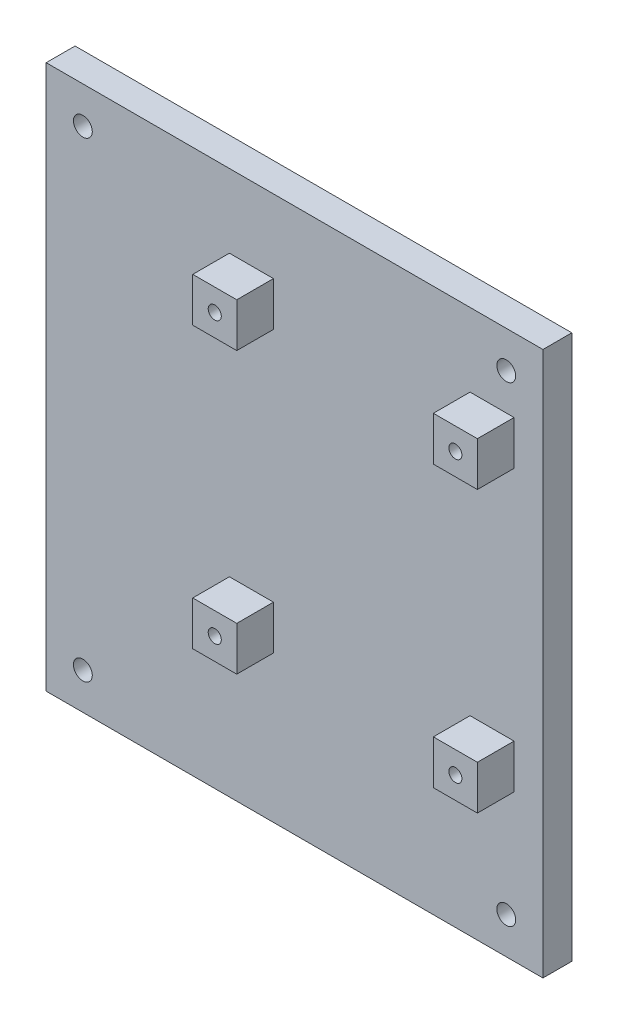
ISO-10303-21;
HEADER;
FILE_DESCRIPTION(('STEP AP214'),'2;1');
FILE_NAME('part.step','',(''),(''),'','','');
FILE_SCHEMA(('AUTOMOTIVE_DESIGN { 1 0 10303 214 1 1 1 1 }'));
ENDSEC;
DATA;
#1=APPLICATION_CONTEXT('core data for automotive mechanical design processes');
#2=APPLICATION_PROTOCOL_DEFINITION('international standard','automotive_design',2000,#1);
#3=PRODUCT_CONTEXT('',#1,'mechanical');
#4=PRODUCT('Part','Part','',(#3));
#5=PRODUCT_RELATED_PRODUCT_CATEGORY('part','',(#4));
#6=PRODUCT_DEFINITION_FORMATION('','',#4);
#7=PRODUCT_DEFINITION_CONTEXT('part definition',#1,'design');
#8=PRODUCT_DEFINITION('design','',#6,#7);
#9=PRODUCT_DEFINITION_SHAPE('','',#8);
#10=(LENGTH_UNIT() NAMED_UNIT(*) SI_UNIT(.MILLI.,.METRE.));
#11=(NAMED_UNIT(*) PLANE_ANGLE_UNIT() SI_UNIT($,.RADIAN.));
#12=(NAMED_UNIT(*) SI_UNIT($,.STERADIAN.) SOLID_ANGLE_UNIT());
#13=UNCERTAINTY_MEASURE_WITH_UNIT(LENGTH_MEASURE(1.E-05),#10,'distance_accuracy_value','');
#14=(GEOMETRIC_REPRESENTATION_CONTEXT(3) GLOBAL_UNCERTAINTY_ASSIGNED_CONTEXT((#13)) GLOBAL_UNIT_ASSIGNED_CONTEXT((#10,
#11,#12)) REPRESENTATION_CONTEXT('',''));
#15=CARTESIAN_POINT('',(0.,0.,0.));
#16=DIRECTION('',(0.,0.,1.));
#17=DIRECTION('',(1.,0.,0.));
#18=AXIS2_PLACEMENT_3D('',#15,#16,#17);
#19=CARTESIAN_POINT('',(0.,0.,4.999999906));
#20=DIRECTION('',(0.,0.,-1.));
#21=DIRECTION('',(-1.,0.,0.));
#22=AXIS2_PLACEMENT_3D('',#19,#20,#21);
#23=PLANE('',#22);
#24=CARTESIAN_POINT('',(-36.649999852,40.767,4.999999906));
#25=DIRECTION('',(0.,0.,1.));
#26=DIRECTION('',(1.,0.,0.));
#27=AXIS2_PLACEMENT_3D('',#24,#25,#26);
#28=CIRCLE('',#27,1.63195);
#29=CARTESIAN_POINT('',(-35.018049852,40.767,4.999999906));
#30=VERTEX_POINT('',#29);
#31=EDGE_CURVE('E797',#30,#30,#28,.T.);
#32=ORIENTED_EDGE('',*,*,#31,.F.);
#33=EDGE_LOOP('',(#32));
#34=FACE_BOUND('',#33,.T.);
#35=CARTESIAN_POINT('',(36.649999852,40.767,4.999999906));
#36=DIRECTION('',(0.,0.,1.));
#37=DIRECTION('',(1.,0.,0.));
#38=AXIS2_PLACEMENT_3D('',#35,#36,#37);
#39=CIRCLE('',#38,1.63195);
#40=CARTESIAN_POINT('',(38.281949852,40.767,4.999999906));
#41=VERTEX_POINT('',#40);
#42=EDGE_CURVE('E799',#41,#41,#39,.T.);
#43=ORIENTED_EDGE('',*,*,#42,.F.);
#44=EDGE_LOOP('',(#43));
#45=FACE_BOUND('',#44,.T.);
#46=CARTESIAN_POINT('',(-36.649999852,-40.767,4.999999906));
#47=DIRECTION('',(0.,0.,1.));
#48=DIRECTION('',(1.,0.,0.));
#49=AXIS2_PLACEMENT_3D('',#46,#47,#48);
#50=CIRCLE('',#49,1.63195);
#51=CARTESIAN_POINT('',(-35.018049852,-40.767,4.999999906));
#52=VERTEX_POINT('',#51);
#53=EDGE_CURVE('E807',#52,#52,#50,.T.);
#54=ORIENTED_EDGE('',*,*,#53,.F.);
#55=EDGE_LOOP('',(#54));
#56=FACE_BOUND('',#55,.T.);
#57=CARTESIAN_POINT('',(36.649999852,-40.767,4.999999906));
#58=DIRECTION('',(0.,0.,1.));
#59=DIRECTION('',(1.,0.,0.));
#60=AXIS2_PLACEMENT_3D('',#57,#58,#59);
#61=CIRCLE('',#60,1.63195);
#62=CARTESIAN_POINT('',(38.281949852,-40.767,4.999999906));
#63=VERTEX_POINT('',#62);
#64=EDGE_CURVE('E813',#63,#63,#61,.T.);
#65=ORIENTED_EDGE('',*,*,#64,.F.);
#66=EDGE_LOOP('',(#65));
#67=FACE_BOUND('',#66,.T.);
#68=DIRECTION('',(0.,-1.,0.));
#69=VECTOR('',#68,1.);
#70=CARTESIAN_POINT('',(-11.276000054,-14.097,4.999999906));
#71=LINE('',#70,#69);
#72=CARTESIAN_POINT('',(-11.276000054,-14.097,4.999999906));
#73=VERTEX_POINT('',#72);
#74=CARTESIAN_POINT('',(-11.276000054,-21.717,4.999999906));
#75=VERTEX_POINT('',#74);
#76=EDGE_CURVE('E245',#73,#75,#71,.T.);
#77=ORIENTED_EDGE('',*,*,#76,.F.);
#78=DIRECTION('',(-1.,0.,0.));
#79=VECTOR('',#78,1.);
#80=CARTESIAN_POINT('',(-11.276000054,-14.097,4.999999906));
#81=LINE('',#80,#79);
#82=CARTESIAN_POINT('',(-3.65600005399999,-14.097,4.999999906));
#83=VERTEX_POINT('',#82);
#84=EDGE_CURVE('E250',#83,#73,#81,.T.);
#85=ORIENTED_EDGE('',*,*,#84,.F.);
#86=DIRECTION('',(0.,1.,0.));
#87=VECTOR('',#86,1.);
#88=CARTESIAN_POINT('',(-3.65600005399999,-14.097,4.999999906));
#89=LINE('',#88,#87);
#90=CARTESIAN_POINT('',(-3.65600005399999,-21.717,4.999999906));
#91=VERTEX_POINT('',#90);
#92=EDGE_CURVE('E262',#91,#83,#89,.T.);
#93=ORIENTED_EDGE('',*,*,#92,.F.);
#94=DIRECTION('',(1.,0.,0.));
#95=VECTOR('',#94,1.);
#96=CARTESIAN_POINT('',(-11.276000054,-21.717,4.999999906));
#97=LINE('',#96,#95);
#98=EDGE_CURVE('E259',#75,#91,#97,.T.);
#99=ORIENTED_EDGE('',*,*,#98,.F.);
#100=EDGE_LOOP('',(#77,#85,#93,#99));
#101=FACE_BOUND('',#100,.T.);
#102=DIRECTION('',(0.,-1.,0.));
#103=VECTOR('',#102,1.);
#104=CARTESIAN_POINT('',(-11.276000054,34.417,4.999999906));
#105=LINE('',#104,#103);
#106=CARTESIAN_POINT('',(-11.276000054,34.417,4.999999906));
#107=VERTEX_POINT('',#106);
#108=CARTESIAN_POINT('',(-11.276000054,26.797,4.999999906));
#109=VERTEX_POINT('',#108);
#110=EDGE_CURVE('E311',#107,#109,#105,.T.);
#111=ORIENTED_EDGE('',*,*,#110,.F.);
#112=DIRECTION('',(-1.,0.,0.));
#113=VECTOR('',#112,1.);
#114=CARTESIAN_POINT('',(-11.276000054,34.417,4.999999906));
#115=LINE('',#114,#113);
#116=CARTESIAN_POINT('',(-3.65600005399999,34.417,4.999999906));
#117=VERTEX_POINT('',#116);
#118=EDGE_CURVE('E316',#117,#107,#115,.T.);
#119=ORIENTED_EDGE('',*,*,#118,.F.);
#120=DIRECTION('',(0.,1.,0.));
#121=VECTOR('',#120,1.);
#122=CARTESIAN_POINT('',(-3.65600005399999,34.417,4.999999906));
#123=LINE('',#122,#121);
#124=CARTESIAN_POINT('',(-3.65600005399999,26.797,4.999999906));
#125=VERTEX_POINT('',#124);
#126=EDGE_CURVE('E328',#125,#117,#123,.T.);
#127=ORIENTED_EDGE('',*,*,#126,.F.);
#128=DIRECTION('',(1.,0.,0.));
#129=VECTOR('',#128,1.);
#130=CARTESIAN_POINT('',(-11.276000054,26.797,4.999999906));
#131=LINE('',#130,#129);
#132=EDGE_CURVE('E325',#109,#125,#131,.T.);
#133=ORIENTED_EDGE('',*,*,#132,.F.);
#134=EDGE_LOOP('',(#111,#119,#127,#133));
#135=FACE_BOUND('',#134,.T.);
#136=DIRECTION('',(0.,1.,0.));
#137=VECTOR('',#136,1.);
#138=CARTESIAN_POINT('',(42.999999852,-47.117,4.999999906));
#139=LINE('',#138,#137);
#140=CARTESIAN_POINT('',(42.999999852,-47.117,4.999999906));
#141=VERTEX_POINT('',#140);
#142=CARTESIAN_POINT('',(42.999999852,47.117,4.999999906));
#143=VERTEX_POINT('',#142);
#144=EDGE_CURVE('E345',#141,#143,#139,.T.);
#145=ORIENTED_EDGE('',*,*,#144,.T.);
#146=DIRECTION('',(-1.,0.,0.));
#147=VECTOR('',#146,1.);
#148=CARTESIAN_POINT('',(-42.999999852,47.117,4.999999906));
#149=LINE('',#148,#147);
#150=CARTESIAN_POINT('',(-42.999999852,47.117,4.999999906));
#151=VERTEX_POINT('',#150);
#152=EDGE_CURVE('E348',#143,#151,#149,.T.);
#153=ORIENTED_EDGE('',*,*,#152,.T.);
#154=DIRECTION('',(0.,-1.,0.));
#155=VECTOR('',#154,1.);
#156=CARTESIAN_POINT('',(-42.999999852,-47.117,4.999999906));
#157=LINE('',#156,#155);
#158=CARTESIAN_POINT('',(-42.999999852,-47.117,4.999999906));
#159=VERTEX_POINT('',#158);
#160=EDGE_CURVE('E351',#151,#159,#157,.T.);
#161=ORIENTED_EDGE('',*,*,#160,.T.);
#162=DIRECTION('',(1.,0.,0.));
#163=VECTOR('',#162,1.);
#164=CARTESIAN_POINT('',(-42.999999852,-47.117,4.999999906));
#165=LINE('',#164,#163);
#166=EDGE_CURVE('E353',#159,#141,#165,.T.);
#167=ORIENTED_EDGE('',*,*,#166,.T.);
#168=EDGE_LOOP('',(#145,#153,#161,#167));
#169=FACE_BOUND('',#168,.T.);
#170=DIRECTION('',(0.,-1.,0.));
#171=VECTOR('',#170,1.);
#172=CARTESIAN_POINT('',(30.379999946,34.417,4.999999906));
#173=LINE('',#172,#171);
#174=CARTESIAN_POINT('',(30.379999946,34.417,4.999999906));
#175=VERTEX_POINT('',#174);
#176=CARTESIAN_POINT('',(30.379999946,26.797,4.999999906));
#177=VERTEX_POINT('',#176);
#178=EDGE_CURVE('E278',#175,#177,#173,.T.);
#179=ORIENTED_EDGE('',*,*,#178,.F.);
#180=DIRECTION('',(-1.,0.,0.));
#181=VECTOR('',#180,1.);
#182=CARTESIAN_POINT('',(30.379999946,34.417,4.999999906));
#183=LINE('',#182,#181);
#184=CARTESIAN_POINT('',(37.999999946,34.417,4.999999906));
#185=VERTEX_POINT('',#184);
#186=EDGE_CURVE('E283',#185,#175,#183,.T.);
#187=ORIENTED_EDGE('',*,*,#186,.F.);
#188=DIRECTION('',(0.,1.,0.));
#189=VECTOR('',#188,1.);
#190=CARTESIAN_POINT('',(37.999999946,34.417,4.999999906));
#191=LINE('',#190,#189);
#192=CARTESIAN_POINT('',(37.999999946,26.797,4.999999906));
#193=VERTEX_POINT('',#192);
#194=EDGE_CURVE('E295',#193,#185,#191,.T.);
#195=ORIENTED_EDGE('',*,*,#194,.F.);
#196=DIRECTION('',(1.,0.,0.));
#197=VECTOR('',#196,1.);
#198=CARTESIAN_POINT('',(30.379999946,26.797,4.999999906));
#199=LINE('',#198,#197);
#200=EDGE_CURVE('E292',#177,#193,#199,.T.);
#201=ORIENTED_EDGE('',*,*,#200,.F.);
#202=EDGE_LOOP('',(#179,#187,#195,#201));
#203=FACE_BOUND('',#202,.T.);
#204=DIRECTION('',(0.,-1.,0.));
#205=VECTOR('',#204,1.);
#206=CARTESIAN_POINT('',(30.379999946,-14.097,4.999999906));
#207=LINE('',#206,#205);
#208=CARTESIAN_POINT('',(30.379999946,-14.097,4.999999906));
#209=VERTEX_POINT('',#208);
#210=CARTESIAN_POINT('',(30.379999946,-21.717,4.999999906));
#211=VERTEX_POINT('',#210);
#212=EDGE_CURVE('E217',#209,#211,#207,.T.);
#213=ORIENTED_EDGE('',*,*,#212,.F.);
#214=DIRECTION('',(-1.,0.,0.));
#215=VECTOR('',#214,1.);
#216=CARTESIAN_POINT('',(30.379999946,-14.097,4.999999906));
#217=LINE('',#216,#215);
#218=CARTESIAN_POINT('',(37.999999946,-14.097,4.999999906));
#219=VERTEX_POINT('',#218);
#220=EDGE_CURVE('E222',#219,#209,#217,.T.);
#221=ORIENTED_EDGE('',*,*,#220,.F.);
#222=DIRECTION('',(0.,1.,0.));
#223=VECTOR('',#222,1.);
#224=CARTESIAN_POINT('',(37.999999946,-14.097,4.999999906));
#225=LINE('',#224,#223);
#226=CARTESIAN_POINT('',(37.999999946,-21.717,4.999999906));
#227=VERTEX_POINT('',#226);
#228=EDGE_CURVE('E57',#227,#219,#225,.T.);
#229=ORIENTED_EDGE('',*,*,#228,.F.);
#230=DIRECTION('',(1.,0.,0.));
#231=VECTOR('',#230,1.);
#232=CARTESIAN_POINT('',(30.379999946,-21.717,4.999999906));
#233=LINE('',#232,#231);
#234=EDGE_CURVE('E52',#211,#227,#233,.T.);
#235=ORIENTED_EDGE('',*,*,#234,.F.);
#236=EDGE_LOOP('',(#213,#221,#229,#235));
#237=FACE_BOUND('',#236,.T.);
#238=ADVANCED_FACE('F37',(#34,#45,#56,#67,#101,#135,#169,#203,#237),#23,.F.);
#239=CARTESIAN_POINT('',(42.999999852,-47.117,4.999999906));
#240=DIRECTION('',(-1.,0.,0.));
#241=DIRECTION('',(0.,0.,1.));
#242=AXIS2_PLACEMENT_3D('',#239,#240,#241);
#243=PLANE('',#242);
#244=DIRECTION('',(0.,1.,0.));
#245=VECTOR('',#244,1.);
#246=CARTESIAN_POINT('',(42.999999852,-47.117,0.));
#247=LINE('',#246,#245);
#248=CARTESIAN_POINT('',(42.999999852,-47.117,0.));
#249=VERTEX_POINT('',#248);
#250=CARTESIAN_POINT('',(42.999999852,47.117,0.));
#251=VERTEX_POINT('',#250);
#252=EDGE_CURVE('E344',#249,#251,#247,.T.);
#253=ORIENTED_EDGE('',*,*,#252,.T.);
#254=DIRECTION('',(0.,0.,-1.));
#255=VECTOR('',#254,1.);
#256=CARTESIAN_POINT('',(42.999999852,47.117,4.999999906));
#257=LINE('',#256,#255);
#258=EDGE_CURVE('E11',#143,#251,#257,.T.);
#259=ORIENTED_EDGE('',*,*,#258,.F.);
#260=ORIENTED_EDGE('',*,*,#144,.F.);
#261=DIRECTION('',(0.,0.,-1.));
#262=VECTOR('',#261,1.);
#263=CARTESIAN_POINT('',(42.999999852,-47.117,4.999999906));
#264=LINE('',#263,#262);
#265=EDGE_CURVE('E355',#141,#249,#264,.T.);
#266=ORIENTED_EDGE('',*,*,#265,.T.);
#267=EDGE_LOOP('',(#253,#259,#260,#266));
#268=FACE_BOUND('',#267,.T.);
#269=ADVANCED_FACE('F39',(#268),#243,.F.);
#270=CARTESIAN_POINT('',(-42.999999852,47.117,4.999999906));
#271=DIRECTION('',(0.,-1.,0.));
#272=DIRECTION('',(0.,0.,-1.));
#273=AXIS2_PLACEMENT_3D('',#270,#271,#272);
#274=PLANE('',#273);
#275=DIRECTION('',(-1.,0.,0.));
#276=VECTOR('',#275,1.);
#277=CARTESIAN_POINT('',(-42.999999852,47.117,0.));
#278=LINE('',#277,#276);
#279=CARTESIAN_POINT('',(-42.999999852,47.117,0.));
#280=VERTEX_POINT('',#279);
#281=EDGE_CURVE('E358',#251,#280,#278,.T.);
#282=ORIENTED_EDGE('',*,*,#281,.T.);
#283=DIRECTION('',(0.,0.,-1.));
#284=VECTOR('',#283,1.);
#285=CARTESIAN_POINT('',(-42.999999852,47.117,4.999999906));
#286=LINE('',#285,#284);
#287=EDGE_CURVE('E45',#151,#280,#286,.T.);
#288=ORIENTED_EDGE('',*,*,#287,.F.);
#289=ORIENTED_EDGE('',*,*,#152,.F.);
#290=ORIENTED_EDGE('',*,*,#258,.T.);
#291=EDGE_LOOP('',(#282,#288,#289,#290));
#292=FACE_BOUND('',#291,.T.);
#293=ADVANCED_FACE('F388',(#292),#274,.F.);
#294=CARTESIAN_POINT('',(-42.999999852,-47.117,4.999999906));
#295=DIRECTION('',(1.,0.,0.));
#296=DIRECTION('',(0.,0.,-1.));
#297=AXIS2_PLACEMENT_3D('',#294,#295,#296);
#298=PLANE('',#297);
#299=DIRECTION('',(0.,-1.,0.));
#300=VECTOR('',#299,1.);
#301=CARTESIAN_POINT('',(-42.999999852,-47.117,0.));
#302=LINE('',#301,#300);
#303=CARTESIAN_POINT('',(-42.999999852,-47.117,0.));
#304=VERTEX_POINT('',#303);
#305=EDGE_CURVE('E360',#280,#304,#302,.T.);
#306=ORIENTED_EDGE('',*,*,#305,.T.);
#307=DIRECTION('',(0.,0.,-1.));
#308=VECTOR('',#307,1.);
#309=CARTESIAN_POINT('',(-42.999999852,-47.117,4.999999906));
#310=LINE('',#309,#308);
#311=EDGE_CURVE('E365',#159,#304,#310,.T.);
#312=ORIENTED_EDGE('',*,*,#311,.F.);
#313=ORIENTED_EDGE('',*,*,#160,.F.);
#314=ORIENTED_EDGE('',*,*,#287,.T.);
#315=EDGE_LOOP('',(#306,#312,#313,#314));
#316=FACE_BOUND('',#315,.T.);
#317=ADVANCED_FACE('F372',(#316),#298,.F.);
#318=CARTESIAN_POINT('',(-42.999999852,-47.117,4.999999906));
#319=DIRECTION('',(0.,1.,0.));
#320=DIRECTION('',(0.,0.,1.));
#321=AXIS2_PLACEMENT_3D('',#318,#319,#320);
#322=PLANE('',#321);
#323=DIRECTION('',(1.,0.,0.));
#324=VECTOR('',#323,1.);
#325=CARTESIAN_POINT('',(-42.999999852,-47.117,0.));
#326=LINE('',#325,#324);
#327=EDGE_CURVE('E349',#304,#249,#326,.T.);
#328=ORIENTED_EDGE('',*,*,#327,.T.);
#329=ORIENTED_EDGE('',*,*,#265,.F.);
#330=ORIENTED_EDGE('',*,*,#166,.F.);
#331=ORIENTED_EDGE('',*,*,#311,.T.);
#332=EDGE_LOOP('',(#328,#329,#330,#331));
#333=FACE_BOUND('',#332,.T.);
#334=ADVANCED_FACE('F381',(#333),#322,.F.);
#335=CARTESIAN_POINT('',(0.,0.,0.));
#336=DIRECTION('',(0.,0.,-1.));
#337=DIRECTION('',(-1.,0.,0.));
#338=AXIS2_PLACEMENT_3D('',#335,#336,#337);
#339=PLANE('',#338);
#340=CARTESIAN_POINT('',(-36.649999852,40.767,0.));
#341=DIRECTION('',(0.,0.,1.));
#342=DIRECTION('',(1.,0.,0.));
#343=AXIS2_PLACEMENT_3D('',#340,#341,#342);
#344=CIRCLE('',#343,1.63195);
#345=CARTESIAN_POINT('',(-35.018049852,40.767,0.));
#346=VERTEX_POINT('',#345);
#347=EDGE_CURVE('E795',#346,#346,#344,.T.);
#348=ORIENTED_EDGE('',*,*,#347,.T.);
#349=EDGE_LOOP('',(#348));
#350=FACE_BOUND('',#349,.T.);
#351=CARTESIAN_POINT('',(36.649999852,40.767,0.));
#352=DIRECTION('',(0.,0.,1.));
#353=DIRECTION('',(1.,0.,0.));
#354=AXIS2_PLACEMENT_3D('',#351,#352,#353);
#355=CIRCLE('',#354,1.63195);
#356=CARTESIAN_POINT('',(38.281949852,40.767,0.));
#357=VERTEX_POINT('',#356);
#358=EDGE_CURVE('E804',#357,#357,#355,.T.);
#359=ORIENTED_EDGE('',*,*,#358,.T.);
#360=EDGE_LOOP('',(#359));
#361=FACE_BOUND('',#360,.T.);
#362=CARTESIAN_POINT('',(-36.649999852,-40.767,0.));
#363=DIRECTION('',(0.,0.,1.));
#364=DIRECTION('',(1.,0.,0.));
#365=AXIS2_PLACEMENT_3D('',#362,#363,#364);
#366=CIRCLE('',#365,1.63195);
#367=CARTESIAN_POINT('',(-35.018049852,-40.767,0.));
#368=VERTEX_POINT('',#367);
#369=EDGE_CURVE('E810',#368,#368,#366,.T.);
#370=ORIENTED_EDGE('',*,*,#369,.T.);
#371=EDGE_LOOP('',(#370));
#372=FACE_BOUND('',#371,.T.);
#373=CARTESIAN_POINT('',(36.649999852,-40.767,0.));
#374=DIRECTION('',(0.,0.,1.));
#375=DIRECTION('',(1.,0.,0.));
#376=AXIS2_PLACEMENT_3D('',#373,#374,#375);
#377=CIRCLE('',#376,1.63195);
#378=CARTESIAN_POINT('',(38.281949852,-40.767,0.));
#379=VERTEX_POINT('',#378);
#380=EDGE_CURVE('E199',#379,#379,#377,.T.);
#381=ORIENTED_EDGE('',*,*,#380,.T.);
#382=EDGE_LOOP('',(#381));
#383=FACE_BOUND('',#382,.T.);
#384=ORIENTED_EDGE('',*,*,#252,.F.);
#385=ORIENTED_EDGE('',*,*,#327,.F.);
#386=ORIENTED_EDGE('',*,*,#305,.F.);
#387=ORIENTED_EDGE('',*,*,#281,.F.);
#388=EDGE_LOOP('',(#384,#385,#386,#387));
#389=FACE_BOUND('',#388,.T.);
#390=ADVANCED_FACE('F378',(#350,#361,#372,#383,#389),#339,.T.);
#391=CARTESIAN_POINT('',(-11.276000054,34.417,11.349999906));
#392=DIRECTION('',(1.,0.,0.));
#393=DIRECTION('',(0.,0.,-1.));
#394=AXIS2_PLACEMENT_3D('',#391,#392,#393);
#395=PLANE('',#394);
#396=ORIENTED_EDGE('',*,*,#110,.T.);
#397=DIRECTION('',(0.,0.,-1.));
#398=VECTOR('',#397,1.);
#399=CARTESIAN_POINT('',(-11.276000054,26.797,11.349999906));
#400=LINE('',#399,#398);
#401=CARTESIAN_POINT('',(-11.276000054,26.797,11.349999906));
#402=VERTEX_POINT('',#401);
#403=EDGE_CURVE('E341',#402,#109,#400,.T.);
#404=ORIENTED_EDGE('',*,*,#403,.F.);
#405=DIRECTION('',(0.,-1.,0.));
#406=VECTOR('',#405,1.);
#407=CARTESIAN_POINT('',(-11.276000054,34.417,11.349999906));
#408=LINE('',#407,#406);
#409=CARTESIAN_POINT('',(-11.276000054,34.417,11.349999906));
#410=VERTEX_POINT('',#409);
#411=EDGE_CURVE('E312',#410,#402,#408,.T.);
#412=ORIENTED_EDGE('',*,*,#411,.F.);
#413=DIRECTION('',(0.,0.,-1.));
#414=VECTOR('',#413,1.);
#415=CARTESIAN_POINT('',(-11.276000054,34.417,11.349999906));
#416=LINE('',#415,#414);
#417=EDGE_CURVE('E322',#410,#107,#416,.T.);
#418=ORIENTED_EDGE('',*,*,#417,.T.);
#419=EDGE_LOOP('',(#396,#404,#412,#418));
#420=FACE_BOUND('',#419,.T.);
#421=ADVANCED_FACE('F404',(#420),#395,.F.);
#422=CARTESIAN_POINT('',(-11.276000054,26.797,11.349999906));
#423=DIRECTION('',(0.,1.,0.));
#424=DIRECTION('',(0.,0.,1.));
#425=AXIS2_PLACEMENT_3D('',#422,#423,#424);
#426=PLANE('',#425);
#427=ORIENTED_EDGE('',*,*,#132,.T.);
#428=DIRECTION('',(0.,0.,-1.));
#429=VECTOR('',#428,1.);
#430=CARTESIAN_POINT('',(-3.65600005399999,26.797,11.349999906));
#431=LINE('',#430,#429);
#432=CARTESIAN_POINT('',(-3.65600005399999,26.797,11.349999906));
#433=VERTEX_POINT('',#432);
#434=EDGE_CURVE('E338',#433,#125,#431,.T.);
#435=ORIENTED_EDGE('',*,*,#434,.F.);
#436=DIRECTION('',(1.,0.,0.));
#437=VECTOR('',#436,1.);
#438=CARTESIAN_POINT('',(-11.276000054,26.797,11.349999906));
#439=LINE('',#438,#437);
#440=EDGE_CURVE('E315',#402,#433,#439,.T.);
#441=ORIENTED_EDGE('',*,*,#440,.F.);
#442=ORIENTED_EDGE('',*,*,#403,.T.);
#443=EDGE_LOOP('',(#427,#435,#441,#442));
#444=FACE_BOUND('',#443,.T.);
#445=ADVANCED_FACE('F425',(#444),#426,.F.);
#446=CARTESIAN_POINT('',(-3.65600005399999,34.417,11.349999906));
#447=DIRECTION('',(-1.,0.,0.));
#448=DIRECTION('',(0.,-1.,0.));
#449=AXIS2_PLACEMENT_3D('',#446,#447,#448);
#450=PLANE('',#449);
#451=ORIENTED_EDGE('',*,*,#126,.T.);
#452=DIRECTION('',(0.,0.,-1.));
#453=VECTOR('',#452,1.);
#454=CARTESIAN_POINT('',(-3.65600005399999,34.417,11.349999906));
#455=LINE('',#454,#453);
#456=CARTESIAN_POINT('',(-3.65600005399999,34.417,11.349999906));
#457=VERTEX_POINT('',#456);
#458=EDGE_CURVE('E335',#457,#117,#455,.T.);
#459=ORIENTED_EDGE('',*,*,#458,.F.);
#460=DIRECTION('',(0.,1.,0.));
#461=VECTOR('',#460,1.);
#462=CARTESIAN_POINT('',(-3.65600005399999,34.417,11.349999906));
#463=LINE('',#462,#461);
#464=EDGE_CURVE('E318',#433,#457,#463,.T.);
#465=ORIENTED_EDGE('',*,*,#464,.F.);
#466=ORIENTED_EDGE('',*,*,#434,.T.);
#467=EDGE_LOOP('',(#451,#459,#465,#466));
#468=FACE_BOUND('',#467,.T.);
#469=ADVANCED_FACE('F432',(#468),#450,.F.);
#470=CARTESIAN_POINT('',(-11.276000054,34.417,11.349999906));
#471=DIRECTION('',(0.,-1.,0.));
#472=DIRECTION('',(0.,0.,-1.));
#473=AXIS2_PLACEMENT_3D('',#470,#471,#472);
#474=PLANE('',#473);
#475=ORIENTED_EDGE('',*,*,#118,.T.);
#476=ORIENTED_EDGE('',*,*,#417,.F.);
#477=DIRECTION('',(-1.,0.,0.));
#478=VECTOR('',#477,1.);
#479=CARTESIAN_POINT('',(-11.276000054,34.417,11.349999906));
#480=LINE('',#479,#478);
#481=EDGE_CURVE('E320',#457,#410,#480,.T.);
#482=ORIENTED_EDGE('',*,*,#481,.F.);
#483=ORIENTED_EDGE('',*,*,#458,.T.);
#484=EDGE_LOOP('',(#475,#476,#482,#483));
#485=FACE_BOUND('',#484,.T.);
#486=ADVANCED_FACE('F439',(#485),#474,.F.);
#487=CARTESIAN_POINT('',(0.,0.,11.349999906));
#488=DIRECTION('',(0.,0.,1.));
#489=DIRECTION('',(1.,0.,0.));
#490=AXIS2_PLACEMENT_3D('',#487,#488,#489);
#491=PLANE('',#490);
#492=CARTESIAN_POINT('',(-7.46600005399999,30.607,11.349999906));
#493=DIRECTION('',(0.,0.,1.));
#494=DIRECTION('',(1.,0.,0.));
#495=AXIS2_PLACEMENT_3D('',#492,#493,#494);
#496=CIRCLE('',#495,1.13029999999999);
#497=CARTESIAN_POINT('',(-6.33570005400001,30.607,11.349999906));
#498=VERTEX_POINT('',#497);
#499=EDGE_CURVE('E193',#498,#498,#496,.T.);
#500=ORIENTED_EDGE('',*,*,#499,.F.);
#501=EDGE_LOOP('',(#500));
#502=FACE_BOUND('',#501,.T.);
#503=ORIENTED_EDGE('',*,*,#411,.T.);
#504=ORIENTED_EDGE('',*,*,#440,.T.);
#505=ORIENTED_EDGE('',*,*,#464,.T.);
#506=ORIENTED_EDGE('',*,*,#481,.T.);
#507=EDGE_LOOP('',(#503,#504,#505,#506));
#508=FACE_BOUND('',#507,.T.);
#509=ADVANCED_FACE('F447',(#502,#508),#491,.T.);
#510=CARTESIAN_POINT('',(30.379999946,34.417,11.349999906));
#511=DIRECTION('',(1.,0.,0.));
#512=DIRECTION('',(0.,1.,0.));
#513=AXIS2_PLACEMENT_3D('',#510,#511,#512);
#514=PLANE('',#513);
#515=ORIENTED_EDGE('',*,*,#178,.T.);
#516=DIRECTION('',(0.,0.,-1.));
#517=VECTOR('',#516,1.);
#518=CARTESIAN_POINT('',(30.379999946,26.797,11.349999906));
#519=LINE('',#518,#517);
#520=CARTESIAN_POINT('',(30.379999946,26.797,11.349999906));
#521=VERTEX_POINT('',#520);
#522=EDGE_CURVE('E308',#521,#177,#519,.T.);
#523=ORIENTED_EDGE('',*,*,#522,.F.);
#524=DIRECTION('',(0.,-1.,0.));
#525=VECTOR('',#524,1.);
#526=CARTESIAN_POINT('',(30.379999946,34.417,11.349999906));
#527=LINE('',#526,#525);
#528=CARTESIAN_POINT('',(30.379999946,34.417,11.349999906));
#529=VERTEX_POINT('',#528);
#530=EDGE_CURVE('E279',#529,#521,#527,.T.);
#531=ORIENTED_EDGE('',*,*,#530,.F.);
#532=DIRECTION('',(0.,0.,-1.));
#533=VECTOR('',#532,1.);
#534=CARTESIAN_POINT('',(30.379999946,34.417,11.349999906));
#535=LINE('',#534,#533);
#536=EDGE_CURVE('E289',#529,#175,#535,.T.);
#537=ORIENTED_EDGE('',*,*,#536,.T.);
#538=EDGE_LOOP('',(#515,#523,#531,#537));
#539=FACE_BOUND('',#538,.T.);
#540=ADVANCED_FACE('F456',(#539),#514,.F.);
#541=CARTESIAN_POINT('',(30.379999946,26.797,11.349999906));
#542=DIRECTION('',(0.,1.,0.));
#543=DIRECTION('',(0.,0.,1.));
#544=AXIS2_PLACEMENT_3D('',#541,#542,#543);
#545=PLANE('',#544);
#546=ORIENTED_EDGE('',*,*,#200,.T.);
#547=DIRECTION('',(0.,0.,-1.));
#548=VECTOR('',#547,1.);
#549=CARTESIAN_POINT('',(37.999999946,26.797,11.349999906));
#550=LINE('',#549,#548);
#551=CARTESIAN_POINT('',(37.999999946,26.797,11.349999906));
#552=VERTEX_POINT('',#551);
#553=EDGE_CURVE('E305',#552,#193,#550,.T.);
#554=ORIENTED_EDGE('',*,*,#553,.F.);
#555=DIRECTION('',(1.,0.,0.));
#556=VECTOR('',#555,1.);
#557=CARTESIAN_POINT('',(30.379999946,26.797,11.349999906));
#558=LINE('',#557,#556);
#559=EDGE_CURVE('E282',#521,#552,#558,.T.);
#560=ORIENTED_EDGE('',*,*,#559,.F.);
#561=ORIENTED_EDGE('',*,*,#522,.T.);
#562=EDGE_LOOP('',(#546,#554,#560,#561));
#563=FACE_BOUND('',#562,.T.);
#564=ADVANCED_FACE('F464',(#563),#545,.F.);
#565=CARTESIAN_POINT('',(37.999999946,34.417,11.349999906));
#566=DIRECTION('',(-1.,0.,0.));
#567=DIRECTION('',(0.,0.,1.));
#568=AXIS2_PLACEMENT_3D('',#565,#566,#567);
#569=PLANE('',#568);
#570=ORIENTED_EDGE('',*,*,#194,.T.);
#571=DIRECTION('',(0.,0.,-1.));
#572=VECTOR('',#571,1.);
#573=CARTESIAN_POINT('',(37.999999946,34.417,11.349999906));
#574=LINE('',#573,#572);
#575=CARTESIAN_POINT('',(37.999999946,34.417,11.349999906));
#576=VERTEX_POINT('',#575);
#577=EDGE_CURVE('E302',#576,#185,#574,.T.);
#578=ORIENTED_EDGE('',*,*,#577,.F.);
#579=DIRECTION('',(0.,1.,0.));
#580=VECTOR('',#579,1.);
#581=CARTESIAN_POINT('',(37.999999946,34.417,11.349999906));
#582=LINE('',#581,#580);
#583=EDGE_CURVE('E285',#552,#576,#582,.T.);
#584=ORIENTED_EDGE('',*,*,#583,.F.);
#585=ORIENTED_EDGE('',*,*,#553,.T.);
#586=EDGE_LOOP('',(#570,#578,#584,#585));
#587=FACE_BOUND('',#586,.T.);
#588=ADVANCED_FACE('F472',(#587),#569,.F.);
#589=CARTESIAN_POINT('',(30.379999946,34.417,11.349999906));
#590=DIRECTION('',(0.,-1.,0.));
#591=DIRECTION('',(0.,0.,-1.));
#592=AXIS2_PLACEMENT_3D('',#589,#590,#591);
#593=PLANE('',#592);
#594=ORIENTED_EDGE('',*,*,#186,.T.);
#595=ORIENTED_EDGE('',*,*,#536,.F.);
#596=DIRECTION('',(-1.,0.,0.));
#597=VECTOR('',#596,1.);
#598=CARTESIAN_POINT('',(30.379999946,34.417,11.349999906));
#599=LINE('',#598,#597);
#600=EDGE_CURVE('E287',#576,#529,#599,.T.);
#601=ORIENTED_EDGE('',*,*,#600,.F.);
#602=ORIENTED_EDGE('',*,*,#577,.T.);
#603=EDGE_LOOP('',(#594,#595,#601,#602));
#604=FACE_BOUND('',#603,.T.);
#605=ADVANCED_FACE('F480',(#604),#593,.F.);
#606=CARTESIAN_POINT('',(0.,0.,11.349999906));
#607=DIRECTION('',(0.,0.,1.));
#608=DIRECTION('',(1.,0.,0.));
#609=AXIS2_PLACEMENT_3D('',#606,#607,#608);
#610=PLANE('',#609);
#611=CARTESIAN_POINT('',(34.189999946,30.607,11.349999906));
#612=DIRECTION('',(0.,0.,1.));
#613=DIRECTION('',(1.,0.,0.));
#614=AXIS2_PLACEMENT_3D('',#611,#612,#613);
#615=CIRCLE('',#614,1.13029999999999);
#616=CARTESIAN_POINT('',(35.320299946,30.607,11.349999906));
#617=VERTEX_POINT('',#616);
#618=EDGE_CURVE('E192',#617,#617,#615,.T.);
#619=ORIENTED_EDGE('',*,*,#618,.F.);
#620=EDGE_LOOP('',(#619));
#621=FACE_BOUND('',#620,.T.);
#622=ORIENTED_EDGE('',*,*,#530,.T.);
#623=ORIENTED_EDGE('',*,*,#559,.T.);
#624=ORIENTED_EDGE('',*,*,#583,.T.);
#625=ORIENTED_EDGE('',*,*,#600,.T.);
#626=EDGE_LOOP('',(#622,#623,#624,#625));
#627=FACE_BOUND('',#626,.T.);
#628=ADVANCED_FACE('F488',(#621,#627),#610,.T.);
#629=CARTESIAN_POINT('',(-11.276000054,-14.097,11.349999906));
#630=DIRECTION('',(1.,0.,0.));
#631=DIRECTION('',(0.,1.,0.));
#632=AXIS2_PLACEMENT_3D('',#629,#630,#631);
#633=PLANE('',#632);
#634=ORIENTED_EDGE('',*,*,#76,.T.);
#635=DIRECTION('',(0.,0.,-1.));
#636=VECTOR('',#635,1.);
#637=CARTESIAN_POINT('',(-11.276000054,-21.717,11.349999906));
#638=LINE('',#637,#636);
#639=CARTESIAN_POINT('',(-11.276000054,-21.717,11.349999906));
#640=VERTEX_POINT('',#639);
#641=EDGE_CURVE('E275',#640,#75,#638,.T.);
#642=ORIENTED_EDGE('',*,*,#641,.F.);
#643=DIRECTION('',(0.,-1.,0.));
#644=VECTOR('',#643,1.);
#645=CARTESIAN_POINT('',(-11.276000054,-14.097,11.349999906));
#646=LINE('',#645,#644);
#647=CARTESIAN_POINT('',(-11.276000054,-14.097,11.349999906));
#648=VERTEX_POINT('',#647);
#649=EDGE_CURVE('E246',#648,#640,#646,.T.);
#650=ORIENTED_EDGE('',*,*,#649,.F.);
#651=DIRECTION('',(0.,0.,-1.));
#652=VECTOR('',#651,1.);
#653=CARTESIAN_POINT('',(-11.276000054,-14.097,11.349999906));
#654=LINE('',#653,#652);
#655=EDGE_CURVE('E256',#648,#73,#654,.T.);
#656=ORIENTED_EDGE('',*,*,#655,.T.);
#657=EDGE_LOOP('',(#634,#642,#650,#656));
#658=FACE_BOUND('',#657,.T.);
#659=ADVANCED_FACE('F497',(#658),#633,.F.);
#660=CARTESIAN_POINT('',(-11.276000054,-21.717,11.349999906));
#661=DIRECTION('',(0.,1.,0.));
#662=DIRECTION('',(0.,0.,1.));
#663=AXIS2_PLACEMENT_3D('',#660,#661,#662);
#664=PLANE('',#663);
#665=ORIENTED_EDGE('',*,*,#98,.T.);
#666=DIRECTION('',(0.,0.,-1.));
#667=VECTOR('',#666,1.);
#668=CARTESIAN_POINT('',(-3.65600005399999,-21.717,11.349999906));
#669=LINE('',#668,#667);
#670=CARTESIAN_POINT('',(-3.65600005399999,-21.717,11.349999906));
#671=VERTEX_POINT('',#670);
#672=EDGE_CURVE('E272',#671,#91,#669,.T.);
#673=ORIENTED_EDGE('',*,*,#672,.F.);
#674=DIRECTION('',(1.,0.,0.));
#675=VECTOR('',#674,1.);
#676=CARTESIAN_POINT('',(-11.276000054,-21.717,11.349999906));
#677=LINE('',#676,#675);
#678=EDGE_CURVE('E249',#640,#671,#677,.T.);
#679=ORIENTED_EDGE('',*,*,#678,.F.);
#680=ORIENTED_EDGE('',*,*,#641,.T.);
#681=EDGE_LOOP('',(#665,#673,#679,#680));
#682=FACE_BOUND('',#681,.T.);
#683=ADVANCED_FACE('F506',(#682),#664,.F.);
#684=CARTESIAN_POINT('',(-3.65600005399999,-14.097,11.349999906));
#685=DIRECTION('',(-1.,0.,0.));
#686=DIRECTION('',(0.,-1.,0.));
#687=AXIS2_PLACEMENT_3D('',#684,#685,#686);
#688=PLANE('',#687);
#689=ORIENTED_EDGE('',*,*,#92,.T.);
#690=DIRECTION('',(0.,0.,-1.));
#691=VECTOR('',#690,1.);
#692=CARTESIAN_POINT('',(-3.65600005399999,-14.097,11.349999906));
#693=LINE('',#692,#691);
#694=CARTESIAN_POINT('',(-3.65600005399999,-14.097,11.349999906));
#695=VERTEX_POINT('',#694);
#696=EDGE_CURVE('E269',#695,#83,#693,.T.);
#697=ORIENTED_EDGE('',*,*,#696,.F.);
#698=DIRECTION('',(0.,1.,0.));
#699=VECTOR('',#698,1.);
#700=CARTESIAN_POINT('',(-3.65600005399999,-14.097,11.349999906));
#701=LINE('',#700,#699);
#702=EDGE_CURVE('E252',#671,#695,#701,.T.);
#703=ORIENTED_EDGE('',*,*,#702,.F.);
#704=ORIENTED_EDGE('',*,*,#672,.T.);
#705=EDGE_LOOP('',(#689,#697,#703,#704));
#706=FACE_BOUND('',#705,.T.);
#707=ADVANCED_FACE('F514',(#706),#688,.F.);
#708=CARTESIAN_POINT('',(-11.276000054,-14.097,11.349999906));
#709=DIRECTION('',(0.,-1.,0.));
#710=DIRECTION('',(0.,0.,-1.));
#711=AXIS2_PLACEMENT_3D('',#708,#709,#710);
#712=PLANE('',#711);
#713=ORIENTED_EDGE('',*,*,#84,.T.);
#714=ORIENTED_EDGE('',*,*,#655,.F.);
#715=DIRECTION('',(-1.,0.,0.));
#716=VECTOR('',#715,1.);
#717=CARTESIAN_POINT('',(-11.276000054,-14.097,11.349999906));
#718=LINE('',#717,#716);
#719=EDGE_CURVE('E254',#695,#648,#718,.T.);
#720=ORIENTED_EDGE('',*,*,#719,.F.);
#721=ORIENTED_EDGE('',*,*,#696,.T.);
#722=EDGE_LOOP('',(#713,#714,#720,#721));
#723=FACE_BOUND('',#722,.T.);
#724=ADVANCED_FACE('F522',(#723),#712,.F.);
#725=CARTESIAN_POINT('',(0.,0.,11.349999906));
#726=DIRECTION('',(0.,0.,1.));
#727=DIRECTION('',(1.,0.,0.));
#728=AXIS2_PLACEMENT_3D('',#725,#726,#727);
#729=PLANE('',#728);
#730=CARTESIAN_POINT('',(-7.46600005399999,-17.907,11.349999906));
#731=DIRECTION('',(0.,0.,1.));
#732=DIRECTION('',(1.,0.,0.));
#733=AXIS2_PLACEMENT_3D('',#730,#731,#732);
#734=CIRCLE('',#733,1.13029999999999);
#735=CARTESIAN_POINT('',(-6.335700054,-17.907,11.349999906));
#736=VERTEX_POINT('',#735);
#737=EDGE_CURVE('E205',#736,#736,#734,.T.);
#738=ORIENTED_EDGE('',*,*,#737,.F.);
#739=EDGE_LOOP('',(#738));
#740=FACE_BOUND('',#739,.T.);
#741=ORIENTED_EDGE('',*,*,#649,.T.);
#742=ORIENTED_EDGE('',*,*,#678,.T.);
#743=ORIENTED_EDGE('',*,*,#702,.T.);
#744=ORIENTED_EDGE('',*,*,#719,.T.);
#745=EDGE_LOOP('',(#741,#742,#743,#744));
#746=FACE_BOUND('',#745,.T.);
#747=ADVANCED_FACE('F530',(#740,#746),#729,.T.);
#748=CARTESIAN_POINT('',(30.379999946,-14.097,11.349999906));
#749=DIRECTION('',(1.,0.,0.));
#750=DIRECTION('',(0.,0.,-1.));
#751=AXIS2_PLACEMENT_3D('',#748,#749,#750);
#752=PLANE('',#751);
#753=ORIENTED_EDGE('',*,*,#212,.T.);
#754=DIRECTION('',(0.,0.,-1.));
#755=VECTOR('',#754,1.);
#756=CARTESIAN_POINT('',(30.379999946,-21.717,11.349999906));
#757=LINE('',#756,#755);
#758=CARTESIAN_POINT('',(30.379999946,-21.717,11.349999906));
#759=VERTEX_POINT('',#758);
#760=EDGE_CURVE('E243',#759,#211,#757,.T.);
#761=ORIENTED_EDGE('',*,*,#760,.F.);
#762=DIRECTION('',(0.,-1.,0.));
#763=VECTOR('',#762,1.);
#764=CARTESIAN_POINT('',(30.379999946,-14.097,11.349999906));
#765=LINE('',#764,#763);
#766=CARTESIAN_POINT('',(30.379999946,-14.097,11.349999906));
#767=VERTEX_POINT('',#766);
#768=EDGE_CURVE('E218',#767,#759,#765,.T.);
#769=ORIENTED_EDGE('',*,*,#768,.F.);
#770=DIRECTION('',(0.,0.,-1.));
#771=VECTOR('',#770,1.);
#772=CARTESIAN_POINT('',(30.379999946,-14.097,11.349999906));
#773=LINE('',#772,#771);
#774=EDGE_CURVE('E228',#767,#209,#773,.T.);
#775=ORIENTED_EDGE('',*,*,#774,.T.);
#776=EDGE_LOOP('',(#753,#761,#769,#775));
#777=FACE_BOUND('',#776,.T.);
#778=ADVANCED_FACE('F539',(#777),#752,.F.);
#779=CARTESIAN_POINT('',(30.379999946,-21.717,11.349999906));
#780=DIRECTION('',(0.,1.,0.));
#781=DIRECTION('',(0.,0.,1.));
#782=AXIS2_PLACEMENT_3D('',#779,#780,#781);
#783=PLANE('',#782);
#784=ORIENTED_EDGE('',*,*,#234,.T.);
#785=DIRECTION('',(0.,0.,-1.));
#786=VECTOR('',#785,1.);
#787=CARTESIAN_POINT('',(37.999999946,-21.717,11.349999906));
#788=LINE('',#787,#786);
#789=CARTESIAN_POINT('',(37.999999946,-21.717,11.349999906));
#790=VERTEX_POINT('',#789);
#791=EDGE_CURVE('E240',#790,#227,#788,.T.);
#792=ORIENTED_EDGE('',*,*,#791,.F.);
#793=DIRECTION('',(1.,0.,0.));
#794=VECTOR('',#793,1.);
#795=CARTESIAN_POINT('',(30.379999946,-21.717,11.349999906));
#796=LINE('',#795,#794);
#797=EDGE_CURVE('E221',#759,#790,#796,.T.);
#798=ORIENTED_EDGE('',*,*,#797,.F.);
#799=ORIENTED_EDGE('',*,*,#760,.T.);
#800=EDGE_LOOP('',(#784,#792,#798,#799));
#801=FACE_BOUND('',#800,.T.);
#802=ADVANCED_FACE('F548',(#801),#783,.F.);
#803=CARTESIAN_POINT('',(37.999999946,-14.097,11.349999906));
#804=DIRECTION('',(-1.,0.,0.));
#805=DIRECTION('',(0.,0.,1.));
#806=AXIS2_PLACEMENT_3D('',#803,#804,#805);
#807=PLANE('',#806);
#808=ORIENTED_EDGE('',*,*,#228,.T.);
#809=DIRECTION('',(0.,0.,-1.));
#810=VECTOR('',#809,1.);
#811=CARTESIAN_POINT('',(37.999999946,-14.097,11.349999906));
#812=LINE('',#811,#810);
#813=CARTESIAN_POINT('',(37.999999946,-14.097,11.349999906));
#814=VERTEX_POINT('',#813);
#815=EDGE_CURVE('E237',#814,#219,#812,.T.);
#816=ORIENTED_EDGE('',*,*,#815,.F.);
#817=DIRECTION('',(0.,1.,0.));
#818=VECTOR('',#817,1.);
#819=CARTESIAN_POINT('',(37.999999946,-14.097,11.349999906));
#820=LINE('',#819,#818);
#821=EDGE_CURVE('E224',#790,#814,#820,.T.);
#822=ORIENTED_EDGE('',*,*,#821,.F.);
#823=ORIENTED_EDGE('',*,*,#791,.T.);
#824=EDGE_LOOP('',(#808,#816,#822,#823));
#825=FACE_BOUND('',#824,.T.);
#826=ADVANCED_FACE('F556',(#825),#807,.F.);
#827=CARTESIAN_POINT('',(30.379999946,-14.097,11.349999906));
#828=DIRECTION('',(0.,-1.,0.));
#829=DIRECTION('',(0.,0.,-1.));
#830=AXIS2_PLACEMENT_3D('',#827,#828,#829);
#831=PLANE('',#830);
#832=ORIENTED_EDGE('',*,*,#220,.T.);
#833=ORIENTED_EDGE('',*,*,#774,.F.);
#834=DIRECTION('',(-1.,0.,0.));
#835=VECTOR('',#834,1.);
#836=CARTESIAN_POINT('',(30.379999946,-14.097,11.349999906));
#837=LINE('',#836,#835);
#838=EDGE_CURVE('E226',#814,#767,#837,.T.);
#839=ORIENTED_EDGE('',*,*,#838,.F.);
#840=ORIENTED_EDGE('',*,*,#815,.T.);
#841=EDGE_LOOP('',(#832,#833,#839,#840));
#842=FACE_BOUND('',#841,.T.);
#843=ADVANCED_FACE('F564',(#842),#831,.F.);
#844=CARTESIAN_POINT('',(0.,0.,11.349999906));
#845=DIRECTION('',(0.,0.,1.));
#846=DIRECTION('',(1.,0.,0.));
#847=AXIS2_PLACEMENT_3D('',#844,#845,#846);
#848=PLANE('',#847);
#849=CARTESIAN_POINT('',(34.189999946,-17.907,11.349999906));
#850=DIRECTION('',(0.,0.,1.));
#851=DIRECTION('',(1.,0.,0.));
#852=AXIS2_PLACEMENT_3D('',#849,#850,#851);
#853=CIRCLE('',#852,1.13029999999999);
#854=CARTESIAN_POINT('',(35.320299946,-17.907,11.349999906));
#855=VERTEX_POINT('',#854);
#856=EDGE_CURVE('E211',#855,#855,#853,.T.);
#857=ORIENTED_EDGE('',*,*,#856,.F.);
#858=EDGE_LOOP('',(#857));
#859=FACE_BOUND('',#858,.T.);
#860=ORIENTED_EDGE('',*,*,#768,.T.);
#861=ORIENTED_EDGE('',*,*,#797,.T.);
#862=ORIENTED_EDGE('',*,*,#821,.T.);
#863=ORIENTED_EDGE('',*,*,#838,.T.);
#864=EDGE_LOOP('',(#860,#861,#862,#863));
#865=FACE_BOUND('',#864,.T.);
#866=ADVANCED_FACE('F572',(#859,#865),#848,.T.);
#867=CARTESIAN_POINT('',(34.189999946,-17.907,6.600199906));
#868=DIRECTION('',(0.,0.,1.));
#869=DIRECTION('',(1.,0.,0.));
#870=AXIS2_PLACEMENT_3D('',#867,#868,#869);
#871=CONICAL_SURFACE('',#870,1.1303,1.02974425867665);
#872=CARTESIAN_POINT('',(34.189999946,-17.907,5.92104714831315));
#873=VERTEX_POINT('',#872);
#874=VERTEX_LOOP('',#873);
#875=FACE_BOUND('',#874,.T.);
#876=CARTESIAN_POINT('',(34.189999946,-17.907,6.600199906));
#877=DIRECTION('',(0.,0.,1.));
#878=DIRECTION('',(1.,0.,0.));
#879=AXIS2_PLACEMENT_3D('',#876,#877,#878);
#880=CIRCLE('',#879,1.1303);
#881=CARTESIAN_POINT('',(35.320299946,-17.907,6.600199906));
#882=VERTEX_POINT('',#881);
#883=EDGE_CURVE('E214',#882,#882,#880,.T.);
#884=ORIENTED_EDGE('',*,*,#883,.T.);
#885=EDGE_LOOP('',(#884));
#886=FACE_BOUND('',#885,.T.);
#887=ADVANCED_FACE('F581',(#875,#886),#871,.F.);
#888=CARTESIAN_POINT('',(34.189999946,-17.907,11.349999906));
#889=DIRECTION('',(0.,0.,1.));
#890=DIRECTION('',(1.,0.,0.));
#891=AXIS2_PLACEMENT_3D('',#888,#889,#890);
#892=CYLINDRICAL_SURFACE('',#891,1.13029999999999);
#893=ORIENTED_EDGE('',*,*,#883,.F.);
#894=EDGE_LOOP('',(#893));
#895=FACE_BOUND('',#894,.T.);
#896=ORIENTED_EDGE('',*,*,#856,.T.);
#897=EDGE_LOOP('',(#896));
#898=FACE_BOUND('',#897,.T.);
#899=ADVANCED_FACE('F591',(#895,#898),#892,.F.);
#900=CARTESIAN_POINT('',(-7.46600005399999,-17.907,6.600199906));
#901=DIRECTION('',(0.,0.,1.));
#902=DIRECTION('',(1.,0.,0.));
#903=AXIS2_PLACEMENT_3D('',#900,#901,#902);
#904=CONICAL_SURFACE('',#903,1.1303,1.02974425867665);
#905=CARTESIAN_POINT('',(-7.46600005399999,-17.907,5.92104714831315));
#906=VERTEX_POINT('',#905);
#907=VERTEX_LOOP('',#906);
#908=FACE_BOUND('',#907,.T.);
#909=CARTESIAN_POINT('',(-7.46600005399999,-17.907,6.600199906));
#910=DIRECTION('',(0.,0.,1.));
#911=DIRECTION('',(1.,0.,0.));
#912=AXIS2_PLACEMENT_3D('',#909,#910,#911);
#913=CIRCLE('',#912,1.1303);
#914=CARTESIAN_POINT('',(-6.33570005399999,-17.907,6.600199906));
#915=VERTEX_POINT('',#914);
#916=EDGE_CURVE('E208',#915,#915,#913,.T.);
#917=ORIENTED_EDGE('',*,*,#916,.T.);
#918=EDGE_LOOP('',(#917));
#919=FACE_BOUND('',#918,.T.);
#920=ADVANCED_FACE('F599',(#908,#919),#904,.F.);
#921=CARTESIAN_POINT('',(-7.46600005399999,-17.907,11.349999906));
#922=DIRECTION('',(0.,0.,1.));
#923=DIRECTION('',(1.,0.,0.));
#924=AXIS2_PLACEMENT_3D('',#921,#922,#923);
#925=CYLINDRICAL_SURFACE('',#924,1.13029999999999);
#926=ORIENTED_EDGE('',*,*,#916,.F.);
#927=EDGE_LOOP('',(#926));
#928=FACE_BOUND('',#927,.T.);
#929=ORIENTED_EDGE('',*,*,#737,.T.);
#930=EDGE_LOOP('',(#929));
#931=FACE_BOUND('',#930,.T.);
#932=ADVANCED_FACE('F607',(#928,#931),#925,.F.);
#933=CARTESIAN_POINT('',(34.189999946,30.607,6.600199906));
#934=DIRECTION('',(0.,0.,1.));
#935=DIRECTION('',(1.,0.,0.));
#936=AXIS2_PLACEMENT_3D('',#933,#934,#935);
#937=CONICAL_SURFACE('',#936,1.1303,1.02974425867665);
#938=CARTESIAN_POINT('',(34.189999946,30.607,5.92104714831315));
#939=VERTEX_POINT('',#938);
#940=VERTEX_LOOP('',#939);
#941=FACE_BOUND('',#940,.T.);
#942=CARTESIAN_POINT('',(34.189999946,30.607,6.600199906));
#943=DIRECTION('',(0.,0.,1.));
#944=DIRECTION('',(1.,0.,0.));
#945=AXIS2_PLACEMENT_3D('',#942,#943,#944);
#946=CIRCLE('',#945,1.1303);
#947=CARTESIAN_POINT('',(35.320299946,30.607,6.600199906));
#948=VERTEX_POINT('',#947);
#949=EDGE_CURVE('E196',#948,#948,#946,.T.);
#950=ORIENTED_EDGE('',*,*,#949,.T.);
#951=EDGE_LOOP('',(#950));
#952=FACE_BOUND('',#951,.T.);
#953=ADVANCED_FACE('F615',(#941,#952),#937,.F.);
#954=CARTESIAN_POINT('',(34.189999946,30.607,11.349999906));
#955=DIRECTION('',(0.,0.,1.));
#956=DIRECTION('',(1.,0.,0.));
#957=AXIS2_PLACEMENT_3D('',#954,#955,#956);
#958=CYLINDRICAL_SURFACE('',#957,1.13029999999999);
#959=ORIENTED_EDGE('',*,*,#949,.F.);
#960=EDGE_LOOP('',(#959));
#961=FACE_BOUND('',#960,.T.);
#962=ORIENTED_EDGE('',*,*,#618,.T.);
#963=EDGE_LOOP('',(#962));
#964=FACE_BOUND('',#963,.T.);
#965=ADVANCED_FACE('F186',(#961,#964),#958,.F.);
#966=CARTESIAN_POINT('',(-7.46600005399999,30.607,6.600199906));
#967=DIRECTION('',(0.,0.,1.));
#968=DIRECTION('',(1.,0.,0.));
#969=AXIS2_PLACEMENT_3D('',#966,#967,#968);
#970=CONICAL_SURFACE('',#969,1.1303,1.02974425867665);
#971=CARTESIAN_POINT('',(-7.466000054,30.607,5.92104714831315));
#972=VERTEX_POINT('',#971);
#973=VERTEX_LOOP('',#972);
#974=FACE_BOUND('',#973,.T.);
#975=CARTESIAN_POINT('',(-7.46600005399999,30.607,6.600199906));
#976=DIRECTION('',(0.,0.,1.));
#977=DIRECTION('',(1.,0.,0.));
#978=AXIS2_PLACEMENT_3D('',#975,#976,#977);
#979=CIRCLE('',#978,1.1303);
#980=CARTESIAN_POINT('',(-6.33570005399999,30.607,6.600199906));
#981=VERTEX_POINT('',#980);
#982=EDGE_CURVE('E190',#981,#981,#979,.T.);
#983=ORIENTED_EDGE('',*,*,#982,.T.);
#984=EDGE_LOOP('',(#983));
#985=FACE_BOUND('',#984,.T.);
#986=ADVANCED_FACE('F182',(#974,#985),#970,.F.);
#987=CARTESIAN_POINT('',(-7.46600005399999,30.607,11.349999906));
#988=DIRECTION('',(0.,0.,1.));
#989=DIRECTION('',(1.,0.,0.));
#990=AXIS2_PLACEMENT_3D('',#987,#988,#989);
#991=CYLINDRICAL_SURFACE('',#990,1.13029999999999);
#992=ORIENTED_EDGE('',*,*,#982,.F.);
#993=EDGE_LOOP('',(#992));
#994=FACE_BOUND('',#993,.T.);
#995=ORIENTED_EDGE('',*,*,#499,.T.);
#996=EDGE_LOOP('',(#995));
#997=FACE_BOUND('',#996,.T.);
#998=ADVANCED_FACE('F185',(#994,#997),#991,.F.);
#999=CARTESIAN_POINT('',(36.649999852,-40.767,4.999999906));
#1000=DIRECTION('',(0.,0.,1.));
#1001=DIRECTION('',(1.,0.,0.));
#1002=AXIS2_PLACEMENT_3D('',#999,#1000,#1001);
#1003=CYLINDRICAL_SURFACE('',#1002,1.63195);
#1004=ORIENTED_EDGE('',*,*,#380,.F.);
#1005=EDGE_LOOP('',(#1004));
#1006=FACE_BOUND('',#1005,.T.);
#1007=ORIENTED_EDGE('',*,*,#64,.T.);
#1008=EDGE_LOOP('',(#1007));
#1009=FACE_BOUND('',#1008,.T.);
#1010=ADVANCED_FACE('F641',(#1006,#1009),#1003,.F.);
#1011=CARTESIAN_POINT('',(-36.649999852,-40.767,4.999999906));
#1012=DIRECTION('',(0.,0.,1.));
#1013=DIRECTION('',(1.,0.,0.));
#1014=AXIS2_PLACEMENT_3D('',#1011,#1012,#1013);
#1015=CYLINDRICAL_SURFACE('',#1014,1.63195);
#1016=ORIENTED_EDGE('',*,*,#369,.F.);
#1017=EDGE_LOOP('',(#1016));
#1018=FACE_BOUND('',#1017,.T.);
#1019=ORIENTED_EDGE('',*,*,#53,.T.);
#1020=EDGE_LOOP('',(#1019));
#1021=FACE_BOUND('',#1020,.T.);
#1022=ADVANCED_FACE('F647',(#1018,#1021),#1015,.F.);
#1023=CARTESIAN_POINT('',(36.649999852,40.767,4.999999906));
#1024=DIRECTION('',(0.,0.,1.));
#1025=DIRECTION('',(1.,0.,0.));
#1026=AXIS2_PLACEMENT_3D('',#1023,#1024,#1025);
#1027=CYLINDRICAL_SURFACE('',#1026,1.63195);
#1028=ORIENTED_EDGE('',*,*,#358,.F.);
#1029=EDGE_LOOP('',(#1028));
#1030=FACE_BOUND('',#1029,.T.);
#1031=ORIENTED_EDGE('',*,*,#42,.T.);
#1032=EDGE_LOOP('',(#1031));
#1033=FACE_BOUND('',#1032,.T.);
#1034=ADVANCED_FACE('F655',(#1030,#1033),#1027,.F.);
#1035=CARTESIAN_POINT('',(-36.649999852,40.767,4.999999906));
#1036=DIRECTION('',(0.,0.,1.));
#1037=DIRECTION('',(1.,0.,0.));
#1038=AXIS2_PLACEMENT_3D('',#1035,#1036,#1037);
#1039=CYLINDRICAL_SURFACE('',#1038,1.63195);
#1040=ORIENTED_EDGE('',*,*,#347,.F.);
#1041=EDGE_LOOP('',(#1040));
#1042=FACE_BOUND('',#1041,.T.);
#1043=ORIENTED_EDGE('',*,*,#31,.T.);
#1044=EDGE_LOOP('',(#1043));
#1045=FACE_BOUND('',#1044,.T.);
#1046=ADVANCED_FACE('F663',(#1042,#1045),#1039,.F.);
#1047=CLOSED_SHELL('',(#238,#269,#293,#317,#334,#390,#421,#445,#469,#486,#509,#540,#564,#588,
#605,#628,#659,#683,#707,#724,#747,#778,#802,#826,#843,#866,#887,#899,#920,#932,#953,#965,#986,
#998,#1010,#1022,#1034,#1046));
#1048=MANIFOLD_SOLID_BREP('B2',#1047);
#1049=ADVANCED_BREP_SHAPE_REPRESENTATION('',(#18,#1048),#14);
#1050=SHAPE_DEFINITION_REPRESENTATION(#9,#1049);
ENDSEC;
END-ISO-10303-21;
